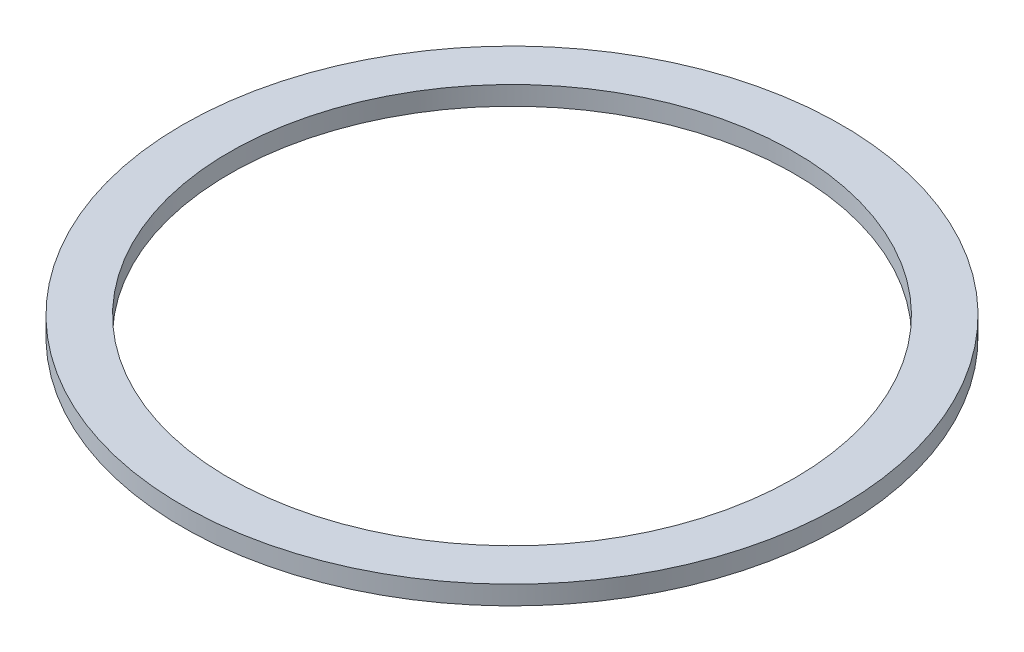
ISO-10303-21;
HEADER;
FILE_DESCRIPTION(('STEP AP214'),'2;1');
FILE_NAME('part.step','',(''),(''),'','','');
FILE_SCHEMA(('AUTOMOTIVE_DESIGN { 1 0 10303 214 1 1 1 1 }'));
ENDSEC;
DATA;
#1=APPLICATION_CONTEXT('core data for automotive mechanical design processes');
#2=APPLICATION_PROTOCOL_DEFINITION('international standard','automotive_design',2000,#1);
#3=PRODUCT_CONTEXT('',#1,'mechanical');
#4=PRODUCT('Part','Part','',(#3));
#5=PRODUCT_RELATED_PRODUCT_CATEGORY('part','',(#4));
#6=PRODUCT_DEFINITION_FORMATION('','',#4);
#7=PRODUCT_DEFINITION_CONTEXT('part definition',#1,'design');
#8=PRODUCT_DEFINITION('design','',#6,#7);
#9=PRODUCT_DEFINITION_SHAPE('','',#8);
#10=(LENGTH_UNIT() NAMED_UNIT(*) SI_UNIT(.MILLI.,.METRE.));
#11=(NAMED_UNIT(*) PLANE_ANGLE_UNIT() SI_UNIT($,.RADIAN.));
#12=(NAMED_UNIT(*) SI_UNIT($,.STERADIAN.) SOLID_ANGLE_UNIT());
#13=UNCERTAINTY_MEASURE_WITH_UNIT(LENGTH_MEASURE(1.E-05),#10,'distance_accuracy_value','');
#14=(GEOMETRIC_REPRESENTATION_CONTEXT(3) GLOBAL_UNCERTAINTY_ASSIGNED_CONTEXT((#13)) GLOBAL_UNIT_ASSIGNED_CONTEXT((#10,
#11,#12)) REPRESENTATION_CONTEXT('',''));
#15=CARTESIAN_POINT('',(0.,0.,0.));
#16=DIRECTION('',(0.,0.,1.));
#17=DIRECTION('',(1.,0.,0.));
#18=AXIS2_PLACEMENT_3D('',#15,#16,#17);
#19=CARTESIAN_POINT('',(34.43,0.,11.16));
#20=DIRECTION('',(0.,-1.,0.));
#21=DIRECTION('',(1.,0.,0.));
#22=AXIS2_PLACEMENT_3D('',#19,#20,#21);
#23=CYLINDRICAL_SURFACE('',#22,1.5);
#24=CARTESIAN_POINT('',(34.43,0.,11.16));
#25=DIRECTION('',(0.,1.,0.));
#26=DIRECTION('',(1.,0.,0.));
#27=AXIS2_PLACEMENT_3D('',#24,#25,#26);
#28=CIRCLE('',#27,1.5);
#29=CARTESIAN_POINT('',(35.93,0.,11.16));
#30=VERTEX_POINT('',#29);
#31=EDGE_CURVE('E10',#30,#30,#28,.T.);
#32=ORIENTED_EDGE('',*,*,#31,.T.);
#33=EDGE_LOOP('',(#32));
#34=FACE_BOUND('',#33,.T.);
#35=CARTESIAN_POINT('',(34.43,-0.1,11.16));
#36=DIRECTION('',(0.,1.,0.));
#37=DIRECTION('',(1.,0.,0.));
#38=AXIS2_PLACEMENT_3D('',#35,#36,#37);
#39=CIRCLE('',#38,1.5);
#40=CARTESIAN_POINT('',(35.93,-0.1,11.16));
#41=VERTEX_POINT('',#40);
#42=EDGE_CURVE('E29',#41,#41,#39,.T.);
#43=ORIENTED_EDGE('',*,*,#42,.F.);
#44=EDGE_LOOP('',(#43));
#45=FACE_BOUND('',#44,.T.);
#46=ADVANCED_FACE('F15',(#34,#45),#23,.F.);
#47=CARTESIAN_POINT('',(34.43,0.,11.16));
#48=DIRECTION('',(0.,-1.,0.));
#49=DIRECTION('',(1.,0.,0.));
#50=AXIS2_PLACEMENT_3D('',#47,#48,#49);
#51=CYLINDRICAL_SURFACE('',#50,1.75);
#52=CARTESIAN_POINT('',(34.43,0.,11.16));
#53=DIRECTION('',(0.,-1.,0.));
#54=DIRECTION('',(1.,0.,0.));
#55=AXIS2_PLACEMENT_3D('',#52,#53,#54);
#56=CIRCLE('',#55,1.75);
#57=CARTESIAN_POINT('',(36.18,0.,11.16));
#58=VERTEX_POINT('',#57);
#59=EDGE_CURVE('E19',#58,#58,#56,.T.);
#60=ORIENTED_EDGE('',*,*,#59,.T.);
#61=EDGE_LOOP('',(#60));
#62=FACE_BOUND('',#61,.T.);
#63=CARTESIAN_POINT('',(34.43,-0.1,11.16));
#64=DIRECTION('',(0.,-1.,0.));
#65=DIRECTION('',(1.,0.,0.));
#66=AXIS2_PLACEMENT_3D('',#63,#64,#65);
#67=CIRCLE('',#66,1.75);
#68=CARTESIAN_POINT('',(36.18,-0.1,11.16));
#69=VERTEX_POINT('',#68);
#70=EDGE_CURVE('E27',#69,#69,#67,.T.);
#71=ORIENTED_EDGE('',*,*,#70,.F.);
#72=EDGE_LOOP('',(#71));
#73=FACE_BOUND('',#72,.T.);
#74=ADVANCED_FACE('F39',(#62,#73),#51,.T.);
#75=CARTESIAN_POINT('',(34.43,-0.1,11.16));
#76=DIRECTION('',(0.,-1.,0.));
#77=DIRECTION('',(1.,0.,0.));
#78=AXIS2_PLACEMENT_3D('',#75,#76,#77);
#79=PLANE('',#78);
#80=ORIENTED_EDGE('',*,*,#70,.T.);
#81=EDGE_LOOP('',(#80));
#82=FACE_BOUND('',#81,.T.);
#83=ORIENTED_EDGE('',*,*,#42,.T.);
#84=EDGE_LOOP('',(#83));
#85=FACE_BOUND('',#84,.T.);
#86=ADVANCED_FACE('F36',(#82,#85),#79,.T.);
#87=CARTESIAN_POINT('',(34.43,0.,11.16));
#88=DIRECTION('',(0.,-1.,0.));
#89=DIRECTION('',(1.,0.,0.));
#90=AXIS2_PLACEMENT_3D('',#87,#88,#89);
#91=PLANE('',#90);
#92=ORIENTED_EDGE('',*,*,#59,.F.);
#93=EDGE_LOOP('',(#92));
#94=FACE_BOUND('',#93,.T.);
#95=ORIENTED_EDGE('',*,*,#31,.F.);
#96=EDGE_LOOP('',(#95));
#97=FACE_BOUND('',#96,.T.);
#98=ADVANCED_FACE('F17',(#94,#97),#91,.F.);
#99=CLOSED_SHELL('',(#46,#74,#86,#98));
#100=MANIFOLD_SOLID_BREP('B1',#99);
#101=ADVANCED_BREP_SHAPE_REPRESENTATION('',(#18,#100),#14);
#102=SHAPE_DEFINITION_REPRESENTATION(#9,#101);
ENDSEC;
END-ISO-10303-21;
